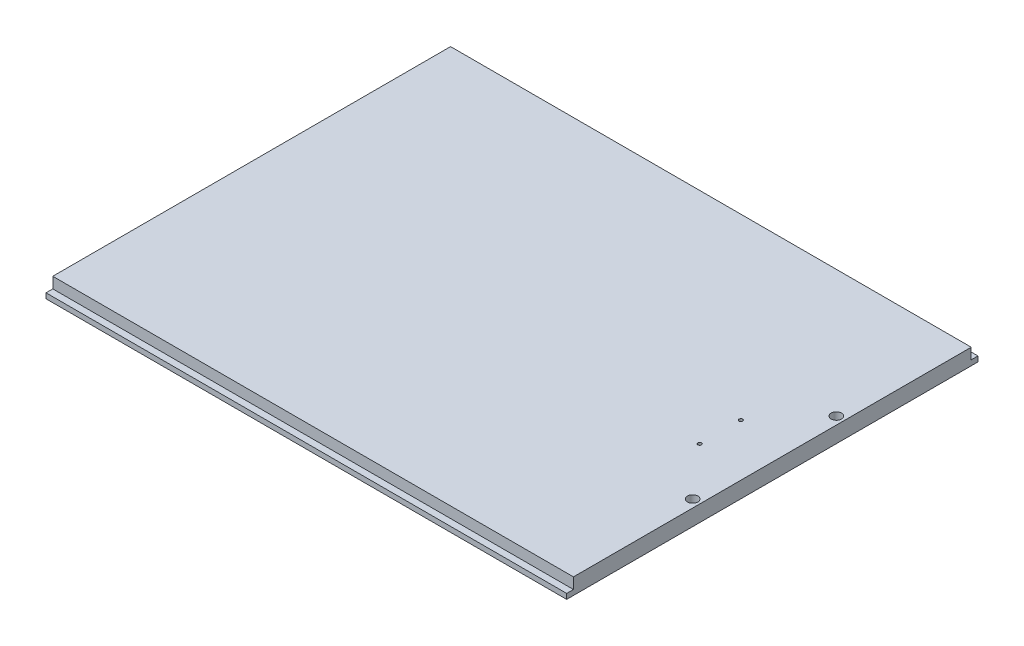
ISO-10303-21;
HEADER;
FILE_DESCRIPTION(('STEP AP214'),'2;1');
FILE_NAME('part.step','',(''),(''),'','','');
FILE_SCHEMA(('AUTOMOTIVE_DESIGN { 1 0 10303 214 1 1 1 1 }'));
ENDSEC;
DATA;
#1=APPLICATION_CONTEXT('core data for automotive mechanical design processes');
#2=APPLICATION_PROTOCOL_DEFINITION('international standard','automotive_design',2000,#1);
#3=PRODUCT_CONTEXT('',#1,'mechanical');
#4=PRODUCT('Part','Part','',(#3));
#5=PRODUCT_RELATED_PRODUCT_CATEGORY('part','',(#4));
#6=PRODUCT_DEFINITION_FORMATION('','',#4);
#7=PRODUCT_DEFINITION_CONTEXT('part definition',#1,'design');
#8=PRODUCT_DEFINITION('design','',#6,#7);
#9=PRODUCT_DEFINITION_SHAPE('','',#8);
#10=(LENGTH_UNIT() NAMED_UNIT(*) SI_UNIT(.MILLI.,.METRE.));
#11=(NAMED_UNIT(*) PLANE_ANGLE_UNIT() SI_UNIT($,.RADIAN.));
#12=(NAMED_UNIT(*) SI_UNIT($,.STERADIAN.) SOLID_ANGLE_UNIT());
#13=UNCERTAINTY_MEASURE_WITH_UNIT(LENGTH_MEASURE(1.E-05),#10,'distance_accuracy_value','');
#14=(GEOMETRIC_REPRESENTATION_CONTEXT(3) GLOBAL_UNCERTAINTY_ASSIGNED_CONTEXT((#13)) GLOBAL_UNIT_ASSIGNED_CONTEXT((#10,
#11,#12)) REPRESENTATION_CONTEXT('',''));
#15=CARTESIAN_POINT('',(0.,0.,0.));
#16=DIRECTION('',(0.,0.,1.));
#17=DIRECTION('',(1.,0.,0.));
#18=AXIS2_PLACEMENT_3D('',#15,#16,#17);
#19=CARTESIAN_POINT('',(98.5,-3.1,13.8));
#20=DIRECTION('',(0.,1.,0.));
#21=DIRECTION('',(0.,0.,1.));
#22=AXIS2_PLACEMENT_3D('',#19,#20,#21);
#23=CYLINDRICAL_SURFACE('',#22,0.600000000000007);
#24=CARTESIAN_POINT('',(98.5,-3.1,13.8));
#25=DIRECTION('',(0.,1.,0.));
#26=DIRECTION('',(0.,0.,1.));
#27=AXIS2_PLACEMENT_3D('',#24,#25,#26);
#28=CIRCLE('',#27,0.600000000000007);
#29=CARTESIAN_POINT('',(98.5,-3.1,14.4));
#30=VERTEX_POINT('',#29);
#31=EDGE_CURVE('E170',#30,#30,#28,.T.);
#32=ORIENTED_EDGE('',*,*,#31,.F.);
#33=EDGE_LOOP('',(#32));
#34=FACE_BOUND('',#33,.T.);
#35=CARTESIAN_POINT('',(98.5,-1.5,13.8));
#36=DIRECTION('',(0.,1.,0.));
#37=DIRECTION('',(0.,0.,1.));
#38=AXIS2_PLACEMENT_3D('',#35,#36,#37);
#39=CIRCLE('',#38,0.600000000000007);
#40=CARTESIAN_POINT('',(98.5,-1.5,14.4));
#41=VERTEX_POINT('',#40);
#42=EDGE_CURVE('E66',#41,#41,#39,.F.);
#43=ORIENTED_EDGE('',*,*,#42,.F.);
#44=EDGE_LOOP('',(#43));
#45=FACE_BOUND('',#44,.T.);
#46=ADVANCED_FACE('F62',(#34,#45),#23,.F.);
#47=CARTESIAN_POINT('',(98.5,-3.1,-13.8));
#48=DIRECTION('',(0.,1.,0.));
#49=DIRECTION('',(0.,0.,1.));
#50=AXIS2_PLACEMENT_3D('',#47,#48,#49);
#51=CYLINDRICAL_SURFACE('',#50,0.600000000000007);
#52=CARTESIAN_POINT('',(98.5,-3.1,-13.8));
#53=DIRECTION('',(0.,1.,0.));
#54=DIRECTION('',(0.,0.,1.));
#55=AXIS2_PLACEMENT_3D('',#52,#53,#54);
#56=CIRCLE('',#55,0.600000000000007);
#57=CARTESIAN_POINT('',(98.5,-3.1,-13.2));
#58=VERTEX_POINT('',#57);
#59=EDGE_CURVE('E189',#58,#58,#56,.T.);
#60=ORIENTED_EDGE('',*,*,#59,.F.);
#61=EDGE_LOOP('',(#60));
#62=FACE_BOUND('',#61,.T.);
#63=CARTESIAN_POINT('',(98.5,-1.5,-13.8));
#64=DIRECTION('',(0.,1.,0.));
#65=DIRECTION('',(0.,0.,1.));
#66=AXIS2_PLACEMENT_3D('',#63,#64,#65);
#67=CIRCLE('',#66,0.600000000000007);
#68=CARTESIAN_POINT('',(98.5,-1.5,-13.2));
#69=VERTEX_POINT('',#68);
#70=EDGE_CURVE('E164',#69,#69,#67,.F.);
#71=ORIENTED_EDGE('',*,*,#70,.F.);
#72=EDGE_LOOP('',(#71));
#73=FACE_BOUND('',#72,.T.);
#74=ADVANCED_FACE('F255',(#62,#73),#51,.F.);
#75=CARTESIAN_POINT('',(100.,0.,38.2));
#76=DIRECTION('',(0.,1.,0.));
#77=DIRECTION('',(0.,0.,1.));
#78=AXIS2_PLACEMENT_3D('',#75,#76,#77);
#79=PLANE('',#78);
#80=CARTESIAN_POINT('',(90.,0.,-3.95));
#81=DIRECTION('',(0.,1.,0.));
#82=DIRECTION('',(0.,0.,1.));
#83=AXIS2_PLACEMENT_3D('',#80,#81,#82);
#84=CIRCLE('',#83,0.350000000000008);
#85=CARTESIAN_POINT('',(90.,0.,-3.59999999999999));
#86=VERTEX_POINT('',#85);
#87=EDGE_CURVE('E305',#86,#86,#84,.T.);
#88=ORIENTED_EDGE('',*,*,#87,.F.);
#89=EDGE_LOOP('',(#88));
#90=FACE_BOUND('',#89,.T.);
#91=CARTESIAN_POINT('',(90.,0.,3.95));
#92=DIRECTION('',(0.,1.,0.));
#93=DIRECTION('',(0.,0.,1.));
#94=AXIS2_PLACEMENT_3D('',#91,#92,#93);
#95=CIRCLE('',#94,0.350000000000008);
#96=CARTESIAN_POINT('',(90.,0.,4.30000000000001));
#97=VERTEX_POINT('',#96);
#98=EDGE_CURVE('E309',#97,#97,#95,.T.);
#99=ORIENTED_EDGE('',*,*,#98,.F.);
#100=EDGE_LOOP('',(#99));
#101=FACE_BOUND('',#100,.T.);
#102=CARTESIAN_POINT('',(98.5,0.,13.8));
#103=DIRECTION('',(0.,1.,0.));
#104=DIRECTION('',(0.,0.,1.));
#105=AXIS2_PLACEMENT_3D('',#102,#103,#104);
#106=CIRCLE('',#105,0.999999999999998);
#107=CARTESIAN_POINT('',(98.5,0.,14.8));
#108=VERTEX_POINT('',#107);
#109=EDGE_CURVE('E172',#108,#108,#106,.T.);
#110=ORIENTED_EDGE('',*,*,#109,.F.);
#111=EDGE_LOOP('',(#110));
#112=FACE_BOUND('',#111,.T.);
#113=CARTESIAN_POINT('',(98.5,0.,-13.8));
#114=DIRECTION('',(0.,1.,0.));
#115=DIRECTION('',(0.,0.,1.));
#116=AXIS2_PLACEMENT_3D('',#113,#114,#115);
#117=CIRCLE('',#116,0.999999999999998);
#118=CARTESIAN_POINT('',(98.5,0.,-12.8));
#119=VERTEX_POINT('',#118);
#120=EDGE_CURVE('E177',#119,#119,#117,.T.);
#121=ORIENTED_EDGE('',*,*,#120,.F.);
#122=EDGE_LOOP('',(#121));
#123=FACE_BOUND('',#122,.T.);
#124=DIRECTION('',(0.,0.,-1.));
#125=VECTOR('',#124,1.);
#126=CARTESIAN_POINT('',(0.,0.,38.2));
#127=LINE('',#126,#125);
#128=CARTESIAN_POINT('',(0.,0.,38.2));
#129=VERTEX_POINT('',#128);
#130=CARTESIAN_POINT('',(0.,0.,-38.2));
#131=VERTEX_POINT('',#130);
#132=EDGE_CURVE('E163',#129,#131,#127,.T.);
#133=ORIENTED_EDGE('',*,*,#132,.F.);
#134=DIRECTION('',(-1.,0.,0.));
#135=VECTOR('',#134,1.);
#136=CARTESIAN_POINT('',(100.,0.,38.2));
#137=LINE('',#136,#135);
#138=CARTESIAN_POINT('',(100.,0.,38.2));
#139=VERTEX_POINT('',#138);
#140=EDGE_CURVE('E12',#139,#129,#137,.T.);
#141=ORIENTED_EDGE('',*,*,#140,.F.);
#142=DIRECTION('',(0.,0.,-1.));
#143=VECTOR('',#142,1.);
#144=CARTESIAN_POINT('',(100.,0.,38.2));
#145=LINE('',#144,#143);
#146=CARTESIAN_POINT('',(100.,0.,-38.2));
#147=VERTEX_POINT('',#146);
#148=EDGE_CURVE('E205',#139,#147,#145,.T.);
#149=ORIENTED_EDGE('',*,*,#148,.T.);
#150=DIRECTION('',(-1.,0.,0.));
#151=VECTOR('',#150,1.);
#152=CARTESIAN_POINT('',(100.,0.,-38.2));
#153=LINE('',#152,#151);
#154=EDGE_CURVE('E214',#147,#131,#153,.T.);
#155=ORIENTED_EDGE('',*,*,#154,.T.);
#156=EDGE_LOOP('',(#133,#141,#149,#155));
#157=FACE_BOUND('',#156,.T.);
#158=ADVANCED_FACE('F242',(#90,#101,#112,#123,#157),#79,.T.);
#159=CARTESIAN_POINT('',(100.,0.,38.2));
#160=DIRECTION('',(0.,0.,-1.));
#161=DIRECTION('',(0.,1.,0.));
#162=AXIS2_PLACEMENT_3D('',#159,#160,#161);
#163=PLANE('',#162);
#164=DIRECTION('',(0.,-1.,0.));
#165=VECTOR('',#164,1.);
#166=CARTESIAN_POINT('',(0.,0.,38.2));
#167=LINE('',#166,#165);
#168=CARTESIAN_POINT('',(0.,-2.1,38.2));
#169=VERTEX_POINT('',#168);
#170=EDGE_CURVE('E208',#129,#169,#167,.T.);
#171=ORIENTED_EDGE('',*,*,#170,.T.);
#172=DIRECTION('',(-1.,0.,0.));
#173=VECTOR('',#172,1.);
#174=CARTESIAN_POINT('',(100.,-2.1,38.2));
#175=LINE('',#174,#173);
#176=CARTESIAN_POINT('',(100.,-2.1,38.2));
#177=VERTEX_POINT('',#176);
#178=EDGE_CURVE('E72',#177,#169,#175,.T.);
#179=ORIENTED_EDGE('',*,*,#178,.F.);
#180=DIRECTION('',(0.,-1.,0.));
#181=VECTOR('',#180,1.);
#182=CARTESIAN_POINT('',(100.,0.,38.2));
#183=LINE('',#182,#181);
#184=EDGE_CURVE('E211',#139,#177,#183,.T.);
#185=ORIENTED_EDGE('',*,*,#184,.F.);
#186=ORIENTED_EDGE('',*,*,#140,.T.);
#187=EDGE_LOOP('',(#171,#179,#185,#186));
#188=FACE_BOUND('',#187,.T.);
#189=ADVANCED_FACE('F241',(#188),#163,.F.);
#190=CARTESIAN_POINT('',(100.,0.,-38.2));
#191=DIRECTION('',(0.,0.,-1.));
#192=DIRECTION('',(0.,1.,0.));
#193=AXIS2_PLACEMENT_3D('',#190,#191,#192);
#194=PLANE('',#193);
#195=DIRECTION('',(0.,-1.,0.));
#196=VECTOR('',#195,1.);
#197=CARTESIAN_POINT('',(0.,0.,-38.2));
#198=LINE('',#197,#196);
#199=CARTESIAN_POINT('',(0.,-2.1,-38.2));
#200=VERTEX_POINT('',#199);
#201=EDGE_CURVE('E216',#131,#200,#198,.T.);
#202=ORIENTED_EDGE('',*,*,#201,.F.);
#203=ORIENTED_EDGE('',*,*,#154,.F.);
#204=DIRECTION('',(0.,-1.,0.));
#205=VECTOR('',#204,1.);
#206=CARTESIAN_POINT('',(100.,0.,-38.2));
#207=LINE('',#206,#205);
#208=CARTESIAN_POINT('',(100.,-2.1,-38.2));
#209=VERTEX_POINT('',#208);
#210=EDGE_CURVE('E207',#147,#209,#207,.T.);
#211=ORIENTED_EDGE('',*,*,#210,.T.);
#212=DIRECTION('',(-1.,0.,0.));
#213=VECTOR('',#212,1.);
#214=CARTESIAN_POINT('',(100.,-2.1,-38.2));
#215=LINE('',#214,#213);
#216=EDGE_CURVE('E220',#209,#200,#215,.T.);
#217=ORIENTED_EDGE('',*,*,#216,.T.);
#218=EDGE_LOOP('',(#202,#203,#211,#217));
#219=FACE_BOUND('',#218,.T.);
#220=ADVANCED_FACE('F246',(#219),#194,.T.);
#221=CARTESIAN_POINT('',(100.,0.,0.));
#222=DIRECTION('',(-1.,0.,0.));
#223=DIRECTION('',(0.,0.,1.));
#224=AXIS2_PLACEMENT_3D('',#221,#222,#223);
#225=PLANE('',#224);
#226=ORIENTED_EDGE('',*,*,#148,.F.);
#227=ORIENTED_EDGE('',*,*,#184,.T.);
#228=DIRECTION('',(0.,0.,-1.));
#229=VECTOR('',#228,1.);
#230=CARTESIAN_POINT('',(100.,-2.1,39.5));
#231=LINE('',#230,#229);
#232=CARTESIAN_POINT('',(100.,-2.1,39.5));
#233=VERTEX_POINT('',#232);
#234=EDGE_CURVE('E138',#233,#177,#231,.T.);
#235=ORIENTED_EDGE('',*,*,#234,.F.);
#236=DIRECTION('',(0.,-1.,0.));
#237=VECTOR('',#236,1.);
#238=CARTESIAN_POINT('',(100.,-2.1,39.5));
#239=LINE('',#238,#237);
#240=CARTESIAN_POINT('',(100.,-3.1,39.5));
#241=VERTEX_POINT('',#240);
#242=EDGE_CURVE('E132',#233,#241,#239,.T.);
#243=ORIENTED_EDGE('',*,*,#242,.T.);
#244=DIRECTION('',(0.,0.,-1.));
#245=VECTOR('',#244,1.);
#246=CARTESIAN_POINT('',(100.,-3.1,39.5));
#247=LINE('',#246,#245);
#248=CARTESIAN_POINT('',(100.,-3.1,-39.5));
#249=VERTEX_POINT('',#248);
#250=EDGE_CURVE('E153',#241,#249,#247,.T.);
#251=ORIENTED_EDGE('',*,*,#250,.T.);
#252=DIRECTION('',(0.,-1.,0.));
#253=VECTOR('',#252,1.);
#254=CARTESIAN_POINT('',(100.,-2.1,-39.5));
#255=LINE('',#254,#253);
#256=CARTESIAN_POINT('',(100.,-2.1,-39.5));
#257=VERTEX_POINT('',#256);
#258=EDGE_CURVE('E224',#257,#249,#255,.T.);
#259=ORIENTED_EDGE('',*,*,#258,.F.);
#260=EDGE_CURVE('E227',#209,#257,#231,.T.);
#261=ORIENTED_EDGE('',*,*,#260,.F.);
#262=ORIENTED_EDGE('',*,*,#210,.F.);
#263=EDGE_LOOP('',(#226,#227,#235,#243,#251,#259,#261,#262));
#264=FACE_BOUND('',#263,.T.);
#265=ADVANCED_FACE('F238',(#264),#225,.F.);
#266=CARTESIAN_POINT('',(0.,0.,0.));
#267=DIRECTION('',(-1.,0.,0.));
#268=DIRECTION('',(0.,0.,1.));
#269=AXIS2_PLACEMENT_3D('',#266,#267,#268);
#270=PLANE('',#269);
#271=CARTESIAN_POINT('',(0.,-1.5,-13.8));
#272=DIRECTION('',(-1.,0.,0.));
#273=DIRECTION('',(0.,0.,1.));
#274=AXIS2_PLACEMENT_3D('',#271,#272,#273);
#275=CIRCLE('',#274,0.349999999999999);
#276=CARTESIAN_POINT('',(0.,-1.5,-13.45));
#277=VERTEX_POINT('',#276);
#278=EDGE_CURVE('E197',#277,#277,#275,.T.);
#279=ORIENTED_EDGE('',*,*,#278,.F.);
#280=EDGE_LOOP('',(#279));
#281=FACE_BOUND('',#280,.T.);
#282=CARTESIAN_POINT('',(0.,-1.5,13.8));
#283=DIRECTION('',(-1.,0.,0.));
#284=DIRECTION('',(0.,0.,1.));
#285=AXIS2_PLACEMENT_3D('',#282,#283,#284);
#286=CIRCLE('',#285,0.349999999999999);
#287=CARTESIAN_POINT('',(0.,-1.5,14.15));
#288=VERTEX_POINT('',#287);
#289=EDGE_CURVE('E200',#288,#288,#286,.T.);
#290=ORIENTED_EDGE('',*,*,#289,.F.);
#291=EDGE_LOOP('',(#290));
#292=FACE_BOUND('',#291,.T.);
#293=ORIENTED_EDGE('',*,*,#132,.T.);
#294=ORIENTED_EDGE('',*,*,#201,.T.);
#295=DIRECTION('',(0.,0.,-1.));
#296=VECTOR('',#295,1.);
#297=CARTESIAN_POINT('',(0.,-2.1,39.5));
#298=LINE('',#297,#296);
#299=CARTESIAN_POINT('',(0.,-2.1,-39.5));
#300=VERTEX_POINT('',#299);
#301=EDGE_CURVE('E121',#200,#300,#298,.T.);
#302=ORIENTED_EDGE('',*,*,#301,.T.);
#303=DIRECTION('',(0.,-1.,0.));
#304=VECTOR('',#303,1.);
#305=CARTESIAN_POINT('',(0.,-2.1,-39.5));
#306=LINE('',#305,#304);
#307=CARTESIAN_POINT('',(0.,-3.1,-39.5));
#308=VERTEX_POINT('',#307);
#309=EDGE_CURVE('E155',#300,#308,#306,.T.);
#310=ORIENTED_EDGE('',*,*,#309,.T.);
#311=DIRECTION('',(0.,0.,-1.));
#312=VECTOR('',#311,1.);
#313=CARTESIAN_POINT('',(0.,-3.1,39.5));
#314=LINE('',#313,#312);
#315=CARTESIAN_POINT('',(0.,-3.1,39.5));
#316=VERTEX_POINT('',#315);
#317=EDGE_CURVE('E147',#316,#308,#314,.T.);
#318=ORIENTED_EDGE('',*,*,#317,.F.);
#319=DIRECTION('',(0.,-1.,0.));
#320=VECTOR('',#319,1.);
#321=CARTESIAN_POINT('',(0.,-2.1,39.5));
#322=LINE('',#321,#320);
#323=CARTESIAN_POINT('',(0.,-2.1,39.5));
#324=VERTEX_POINT('',#323);
#325=EDGE_CURVE('E130',#324,#316,#322,.T.);
#326=ORIENTED_EDGE('',*,*,#325,.F.);
#327=EDGE_CURVE('E144',#324,#169,#298,.T.);
#328=ORIENTED_EDGE('',*,*,#327,.T.);
#329=ORIENTED_EDGE('',*,*,#170,.F.);
#330=EDGE_LOOP('',(#293,#294,#302,#310,#318,#326,#328,#329));
#331=FACE_BOUND('',#330,.T.);
#332=ADVANCED_FACE('F142',(#281,#292,#331),#270,.T.);
#333=CARTESIAN_POINT('',(100.,-3.1,39.5));
#334=DIRECTION('',(0.,1.,0.));
#335=DIRECTION('',(0.,0.,1.));
#336=AXIS2_PLACEMENT_3D('',#333,#334,#335);
#337=PLANE('',#336);
#338=CARTESIAN_POINT('',(90.,-3.1,-3.95));
#339=DIRECTION('',(0.,1.,0.));
#340=DIRECTION('',(0.,0.,1.));
#341=AXIS2_PLACEMENT_3D('',#338,#339,#340);
#342=CIRCLE('',#341,0.350000000000008);
#343=CARTESIAN_POINT('',(90.,-3.1,-3.59999999999999));
#344=VERTEX_POINT('',#343);
#345=EDGE_CURVE('E188',#344,#344,#342,.T.);
#346=ORIENTED_EDGE('',*,*,#345,.T.);
#347=EDGE_LOOP('',(#346));
#348=FACE_BOUND('',#347,.T.);
#349=CARTESIAN_POINT('',(90.,-3.1,3.95));
#350=DIRECTION('',(0.,1.,0.));
#351=DIRECTION('',(0.,0.,1.));
#352=AXIS2_PLACEMENT_3D('',#349,#350,#351);
#353=CIRCLE('',#352,0.350000000000008);
#354=CARTESIAN_POINT('',(90.,-3.1,4.30000000000001));
#355=VERTEX_POINT('',#354);
#356=EDGE_CURVE('E180',#355,#355,#353,.T.);
#357=ORIENTED_EDGE('',*,*,#356,.T.);
#358=EDGE_LOOP('',(#357));
#359=FACE_BOUND('',#358,.T.);
#360=ORIENTED_EDGE('',*,*,#59,.T.);
#361=EDGE_LOOP('',(#360));
#362=FACE_BOUND('',#361,.T.);
#363=ORIENTED_EDGE('',*,*,#31,.T.);
#364=EDGE_LOOP('',(#363));
#365=FACE_BOUND('',#364,.T.);
#366=ORIENTED_EDGE('',*,*,#317,.T.);
#367=DIRECTION('',(-1.,0.,0.));
#368=VECTOR('',#367,1.);
#369=CARTESIAN_POINT('',(100.,-3.1,-39.5));
#370=LINE('',#369,#368);
#371=EDGE_CURVE('E160',#249,#308,#370,.T.);
#372=ORIENTED_EDGE('',*,*,#371,.F.);
#373=ORIENTED_EDGE('',*,*,#250,.F.);
#374=DIRECTION('',(-1.,0.,0.));
#375=VECTOR('',#374,1.);
#376=CARTESIAN_POINT('',(100.,-3.1,39.5));
#377=LINE('',#376,#375);
#378=EDGE_CURVE('E162',#241,#316,#377,.T.);
#379=ORIENTED_EDGE('',*,*,#378,.T.);
#380=EDGE_LOOP('',(#366,#372,#373,#379));
#381=FACE_BOUND('',#380,.T.);
#382=ADVANCED_FACE('F235',(#348,#359,#362,#365,#381),#337,.F.);
#383=CARTESIAN_POINT('',(100.,-2.1,-39.5));
#384=DIRECTION('',(0.,0.,-1.));
#385=DIRECTION('',(0.,1.,0.));
#386=AXIS2_PLACEMENT_3D('',#383,#384,#385);
#387=PLANE('',#386);
#388=ORIENTED_EDGE('',*,*,#309,.F.);
#389=DIRECTION('',(-1.,0.,0.));
#390=VECTOR('',#389,1.);
#391=CARTESIAN_POINT('',(100.,-2.1,-39.5));
#392=LINE('',#391,#390);
#393=EDGE_CURVE('E137',#257,#300,#392,.T.);
#394=ORIENTED_EDGE('',*,*,#393,.F.);
#395=ORIENTED_EDGE('',*,*,#258,.T.);
#396=ORIENTED_EDGE('',*,*,#371,.T.);
#397=EDGE_LOOP('',(#388,#394,#395,#396));
#398=FACE_BOUND('',#397,.T.);
#399=ADVANCED_FACE('F233',(#398),#387,.T.);
#400=CARTESIAN_POINT('',(100.,-2.1,39.5));
#401=DIRECTION('',(0.,0.,-1.));
#402=DIRECTION('',(0.,1.,0.));
#403=AXIS2_PLACEMENT_3D('',#400,#401,#402);
#404=PLANE('',#403);
#405=ORIENTED_EDGE('',*,*,#325,.T.);
#406=ORIENTED_EDGE('',*,*,#378,.F.);
#407=ORIENTED_EDGE('',*,*,#242,.F.);
#408=DIRECTION('',(-1.,0.,0.));
#409=VECTOR('',#408,1.);
#410=CARTESIAN_POINT('',(100.,-2.1,39.5));
#411=LINE('',#410,#409);
#412=EDGE_CURVE('E127',#233,#324,#411,.T.);
#413=ORIENTED_EDGE('',*,*,#412,.T.);
#414=EDGE_LOOP('',(#405,#406,#407,#413));
#415=FACE_BOUND('',#414,.T.);
#416=ADVANCED_FACE('F64',(#415),#404,.F.);
#417=CARTESIAN_POINT('',(100.,-2.1,39.5));
#418=DIRECTION('',(0.,1.,0.));
#419=DIRECTION('',(0.,0.,1.));
#420=AXIS2_PLACEMENT_3D('',#417,#418,#419);
#421=PLANE('',#420);
#422=ORIENTED_EDGE('',*,*,#234,.T.);
#423=ORIENTED_EDGE('',*,*,#178,.T.);
#424=ORIENTED_EDGE('',*,*,#327,.F.);
#425=ORIENTED_EDGE('',*,*,#412,.F.);
#426=EDGE_LOOP('',(#422,#423,#424,#425));
#427=FACE_BOUND('',#426,.T.);
#428=ADVANCED_FACE('F151',(#427),#421,.T.);
#429=ORIENTED_EDGE('',*,*,#216,.F.);
#430=ORIENTED_EDGE('',*,*,#260,.T.);
#431=ORIENTED_EDGE('',*,*,#393,.T.);
#432=ORIENTED_EDGE('',*,*,#301,.F.);
#433=EDGE_LOOP('',(#429,#430,#431,#432));
#434=FACE_BOUND('',#433,.T.);
#435=ADVANCED_FACE('F250',(#434),#421,.T.);
#436=CARTESIAN_POINT('',(3.,-1.5,13.8));
#437=DIRECTION('',(-1.,0.,0.));
#438=DIRECTION('',(0.,0.,1.));
#439=AXIS2_PLACEMENT_3D('',#436,#437,#438);
#440=CYLINDRICAL_SURFACE('',#439,0.349999999999999);
#441=CARTESIAN_POINT('',(3.,-1.5,13.8));
#442=DIRECTION('',(-1.,0.,0.));
#443=DIRECTION('',(0.,0.,1.));
#444=AXIS2_PLACEMENT_3D('',#441,#442,#443);
#445=CIRCLE('',#444,0.349999999999999);
#446=CARTESIAN_POINT('',(3.,-1.5,14.15));
#447=VERTEX_POINT('',#446);
#448=EDGE_CURVE('E192',#447,#447,#445,.T.);
#449=ORIENTED_EDGE('',*,*,#448,.F.);
#450=EDGE_LOOP('',(#449));
#451=FACE_BOUND('',#450,.T.);
#452=ORIENTED_EDGE('',*,*,#289,.T.);
#453=EDGE_LOOP('',(#452));
#454=FACE_BOUND('',#453,.T.);
#455=ADVANCED_FACE('F253',(#451,#454),#440,.F.);
#456=CARTESIAN_POINT('',(3.,-1.5,13.8));
#457=DIRECTION('',(-1.,0.,0.));
#458=DIRECTION('',(0.,0.,1.));
#459=AXIS2_PLACEMENT_3D('',#456,#457,#458);
#460=PLANE('',#459);
#461=ORIENTED_EDGE('',*,*,#448,.T.);
#462=EDGE_LOOP('',(#461));
#463=FACE_BOUND('',#462,.T.);
#464=ADVANCED_FACE('F260',(#463),#460,.T.);
#465=CARTESIAN_POINT('',(3.,-1.5,-13.8));
#466=DIRECTION('',(-1.,0.,0.));
#467=DIRECTION('',(0.,0.,1.));
#468=AXIS2_PLACEMENT_3D('',#465,#466,#467);
#469=CYLINDRICAL_SURFACE('',#468,0.349999999999999);
#470=CARTESIAN_POINT('',(3.,-1.5,-13.8));
#471=DIRECTION('',(-1.,0.,0.));
#472=DIRECTION('',(0.,0.,1.));
#473=AXIS2_PLACEMENT_3D('',#470,#471,#472);
#474=CIRCLE('',#473,0.349999999999999);
#475=CARTESIAN_POINT('',(3.,-1.5,-13.45));
#476=VERTEX_POINT('',#475);
#477=EDGE_CURVE('E149',#476,#476,#474,.T.);
#478=ORIENTED_EDGE('',*,*,#477,.F.);
#479=EDGE_LOOP('',(#478));
#480=FACE_BOUND('',#479,.T.);
#481=ORIENTED_EDGE('',*,*,#278,.T.);
#482=EDGE_LOOP('',(#481));
#483=FACE_BOUND('',#482,.T.);
#484=ADVANCED_FACE('F282',(#480,#483),#469,.F.);
#485=CARTESIAN_POINT('',(3.,-1.5,-13.8));
#486=DIRECTION('',(-1.,0.,0.));
#487=DIRECTION('',(0.,0.,1.));
#488=AXIS2_PLACEMENT_3D('',#485,#486,#487);
#489=PLANE('',#488);
#490=ORIENTED_EDGE('',*,*,#477,.T.);
#491=EDGE_LOOP('',(#490));
#492=FACE_BOUND('',#491,.T.);
#493=ADVANCED_FACE('F278',(#492),#489,.T.);
#494=CARTESIAN_POINT('',(98.5,-1.5,-13.8));
#495=DIRECTION('',(0.,1.,0.));
#496=DIRECTION('',(0.,0.,1.));
#497=AXIS2_PLACEMENT_3D('',#494,#495,#496);
#498=PLANE('',#497);
#499=CARTESIAN_POINT('',(98.5,-1.5,-13.8));
#500=DIRECTION('',(0.,1.,0.));
#501=DIRECTION('',(0.,0.,1.));
#502=AXIS2_PLACEMENT_3D('',#499,#500,#501);
#503=CIRCLE('',#502,0.999999999999998);
#504=CARTESIAN_POINT('',(98.5,-1.5,-12.8));
#505=VERTEX_POINT('',#504);
#506=EDGE_CURVE('E185',#505,#505,#503,.T.);
#507=ORIENTED_EDGE('',*,*,#506,.T.);
#508=EDGE_LOOP('',(#507));
#509=FACE_BOUND('',#508,.T.);
#510=ORIENTED_EDGE('',*,*,#70,.T.);
#511=EDGE_LOOP('',(#510));
#512=FACE_BOUND('',#511,.T.);
#513=ADVANCED_FACE('F281',(#509,#512),#498,.T.);
#514=CARTESIAN_POINT('',(98.5,-1.5,-13.8));
#515=DIRECTION('',(0.,1.,0.));
#516=DIRECTION('',(0.,0.,1.));
#517=AXIS2_PLACEMENT_3D('',#514,#515,#516);
#518=CYLINDRICAL_SURFACE('',#517,0.999999999999998);
#519=ORIENTED_EDGE('',*,*,#506,.F.);
#520=EDGE_LOOP('',(#519));
#521=FACE_BOUND('',#520,.T.);
#522=ORIENTED_EDGE('',*,*,#120,.T.);
#523=EDGE_LOOP('',(#522));
#524=FACE_BOUND('',#523,.T.);
#525=ADVANCED_FACE('F314',(#521,#524),#518,.F.);
#526=CARTESIAN_POINT('',(98.5,-1.5,13.8));
#527=DIRECTION('',(0.,1.,0.));
#528=DIRECTION('',(0.,0.,1.));
#529=AXIS2_PLACEMENT_3D('',#526,#527,#528);
#530=PLANE('',#529);
#531=CARTESIAN_POINT('',(98.5,-1.5,13.8));
#532=DIRECTION('',(0.,1.,0.));
#533=DIRECTION('',(0.,0.,1.));
#534=AXIS2_PLACEMENT_3D('',#531,#532,#533);
#535=CIRCLE('',#534,0.999999999999998);
#536=CARTESIAN_POINT('',(98.5,-1.5,14.8));
#537=VERTEX_POINT('',#536);
#538=EDGE_CURVE('E166',#537,#537,#535,.T.);
#539=ORIENTED_EDGE('',*,*,#538,.T.);
#540=EDGE_LOOP('',(#539));
#541=FACE_BOUND('',#540,.T.);
#542=ORIENTED_EDGE('',*,*,#42,.T.);
#543=EDGE_LOOP('',(#542));
#544=FACE_BOUND('',#543,.T.);
#545=ADVANCED_FACE('F316',(#541,#544),#530,.T.);
#546=CARTESIAN_POINT('',(98.5,-1.5,13.8));
#547=DIRECTION('',(0.,1.,0.));
#548=DIRECTION('',(0.,0.,1.));
#549=AXIS2_PLACEMENT_3D('',#546,#547,#548);
#550=CYLINDRICAL_SURFACE('',#549,0.999999999999998);
#551=ORIENTED_EDGE('',*,*,#538,.F.);
#552=EDGE_LOOP('',(#551));
#553=FACE_BOUND('',#552,.T.);
#554=ORIENTED_EDGE('',*,*,#109,.T.);
#555=EDGE_LOOP('',(#554));
#556=FACE_BOUND('',#555,.T.);
#557=ADVANCED_FACE('F323',(#553,#556),#550,.F.);
#558=CARTESIAN_POINT('',(90.,-3.1,3.95));
#559=DIRECTION('',(0.,1.,0.));
#560=DIRECTION('',(0.,0.,1.));
#561=AXIS2_PLACEMENT_3D('',#558,#559,#560);
#562=CYLINDRICAL_SURFACE('',#561,0.350000000000008);
#563=ORIENTED_EDGE('',*,*,#356,.F.);
#564=EDGE_LOOP('',(#563));
#565=FACE_BOUND('',#564,.T.);
#566=ORIENTED_EDGE('',*,*,#98,.T.);
#567=EDGE_LOOP('',(#566));
#568=FACE_BOUND('',#567,.T.);
#569=ADVANCED_FACE('F329',(#565,#568),#562,.F.);
#570=CARTESIAN_POINT('',(90.,-3.1,-3.95));
#571=DIRECTION('',(0.,1.,0.));
#572=DIRECTION('',(0.,0.,1.));
#573=AXIS2_PLACEMENT_3D('',#570,#571,#572);
#574=CYLINDRICAL_SURFACE('',#573,0.350000000000008);
#575=ORIENTED_EDGE('',*,*,#345,.F.);
#576=EDGE_LOOP('',(#575));
#577=FACE_BOUND('',#576,.T.);
#578=ORIENTED_EDGE('',*,*,#87,.T.);
#579=EDGE_LOOP('',(#578));
#580=FACE_BOUND('',#579,.T.);
#581=ADVANCED_FACE('F334',(#577,#580),#574,.F.);
#582=CLOSED_SHELL('',(#46,#74,#158,#189,#220,#265,#332,#382,#399,#416,#428,#435,#455,#464,#484,
#493,#513,#525,#545,#557,#569,#581));
#583=MANIFOLD_SOLID_BREP('B2',#582);
#584=ADVANCED_BREP_SHAPE_REPRESENTATION('',(#18,#583),#14);
#585=SHAPE_DEFINITION_REPRESENTATION(#9,#584);
ENDSEC;
END-ISO-10303-21;
